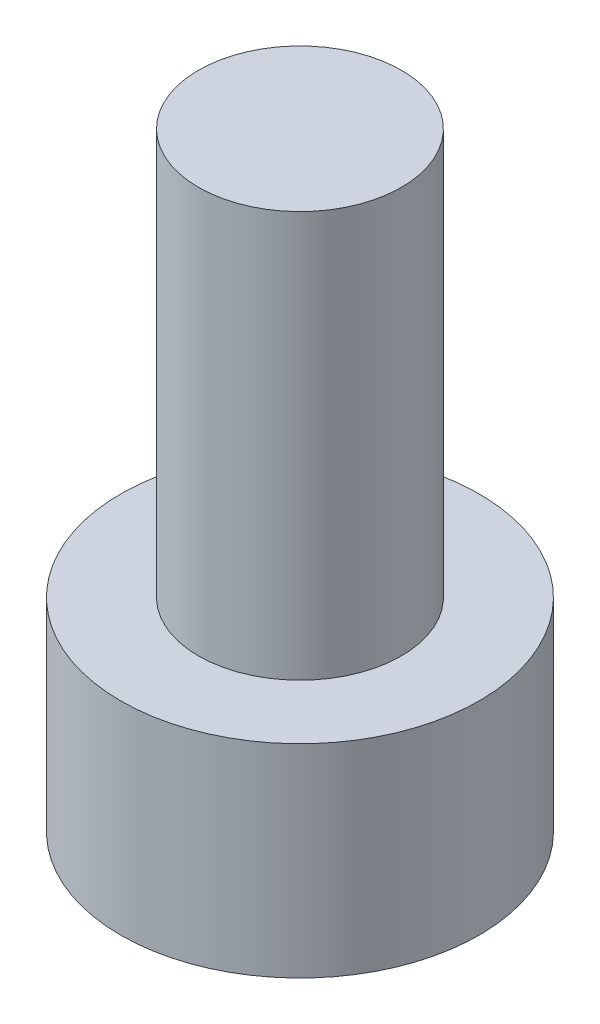
ISO-10303-21;
HEADER;
FILE_DESCRIPTION(('STEP AP214'),'2;1');
FILE_NAME('part.step','',(''),(''),'','','');
FILE_SCHEMA(('AUTOMOTIVE_DESIGN { 1 0 10303 214 1 1 1 1 }'));
ENDSEC;
DATA;
#1=APPLICATION_CONTEXT('core data for automotive mechanical design processes');
#2=APPLICATION_PROTOCOL_DEFINITION('international standard','automotive_design',2000,#1);
#3=PRODUCT_CONTEXT('',#1,'mechanical');
#4=PRODUCT('Part','Part','',(#3));
#5=PRODUCT_RELATED_PRODUCT_CATEGORY('part','',(#4));
#6=PRODUCT_DEFINITION_FORMATION('','',#4);
#7=PRODUCT_DEFINITION_CONTEXT('part definition',#1,'design');
#8=PRODUCT_DEFINITION('design','',#6,#7);
#9=PRODUCT_DEFINITION_SHAPE('','',#8);
#10=(LENGTH_UNIT() NAMED_UNIT(*) SI_UNIT(.MILLI.,.METRE.));
#11=(NAMED_UNIT(*) PLANE_ANGLE_UNIT() SI_UNIT($,.RADIAN.));
#12=(NAMED_UNIT(*) SI_UNIT($,.STERADIAN.) SOLID_ANGLE_UNIT());
#13=UNCERTAINTY_MEASURE_WITH_UNIT(LENGTH_MEASURE(1.E-05),#10,'distance_accuracy_value','');
#14=(GEOMETRIC_REPRESENTATION_CONTEXT(3) GLOBAL_UNCERTAINTY_ASSIGNED_CONTEXT((#13)) GLOBAL_UNIT_ASSIGNED_CONTEXT((#10,
#11,#12)) REPRESENTATION_CONTEXT('',''));
#15=CARTESIAN_POINT('',(0.,0.,0.));
#16=DIRECTION('',(0.,0.,1.));
#17=DIRECTION('',(1.,0.,0.));
#18=AXIS2_PLACEMENT_3D('',#15,#16,#17);
#19=CARTESIAN_POINT('',(0.,3.,0.));
#20=DIRECTION('',(0.,1.,0.));
#21=DIRECTION('',(0.,0.,1.));
#22=AXIS2_PLACEMENT_3D('',#19,#20,#21);
#23=PLANE('',#22);
#24=CARTESIAN_POINT('',(0.,3.,0.));
#25=DIRECTION('',(0.,1.,0.));
#26=DIRECTION('',(0.,0.,1.));
#27=AXIS2_PLACEMENT_3D('',#24,#25,#26);
#28=CIRCLE('',#27,1.5);
#29=CARTESIAN_POINT('',(0.,3.,1.5));
#30=VERTEX_POINT('',#29);
#31=EDGE_CURVE('E180',#30,#30,#28,.T.);
#32=ORIENTED_EDGE('',*,*,#31,.F.);
#33=EDGE_LOOP('',(#32));
#34=FACE_BOUND('',#33,.T.);
#35=CARTESIAN_POINT('',(0.,3.,0.));
#36=DIRECTION('',(0.,1.,0.));
#37=DIRECTION('',(0.,0.,1.));
#38=AXIS2_PLACEMENT_3D('',#35,#36,#37);
#39=CIRCLE('',#38,2.65);
#40=CARTESIAN_POINT('',(0.,3.,2.65));
#41=VERTEX_POINT('',#40);
#42=EDGE_CURVE('E11',#41,#41,#39,.T.);
#43=ORIENTED_EDGE('',*,*,#42,.T.);
#44=EDGE_LOOP('',(#43));
#45=FACE_BOUND('',#44,.T.);
#46=ADVANCED_FACE('F44',(#34,#45),#23,.T.);
#47=CARTESIAN_POINT('',(0.,0.,0.));
#48=DIRECTION('',(0.,1.,0.));
#49=DIRECTION('',(0.,0.,1.));
#50=AXIS2_PLACEMENT_3D('',#47,#48,#49);
#51=PLANE('',#50);
#52=CARTESIAN_POINT('',(0.,0.,0.));
#53=DIRECTION('',(0.,1.,0.));
#54=DIRECTION('',(0.,0.,1.));
#55=AXIS2_PLACEMENT_3D('',#52,#53,#54);
#56=CIRCLE('',#55,2.65);
#57=CARTESIAN_POINT('',(0.,0.,2.65));
#58=VERTEX_POINT('',#57);
#59=EDGE_CURVE('E48',#58,#58,#56,.T.);
#60=ORIENTED_EDGE('',*,*,#59,.F.);
#61=EDGE_LOOP('',(#60));
#62=FACE_BOUND('',#61,.T.);
#63=DIRECTION('',(-0.5,0.,-0.866025403784438));
#64=VECTOR('',#63,1.);
#65=CARTESIAN_POINT('',(1.44337567297406,0.,0.));
#66=LINE('',#65,#64);
#67=CARTESIAN_POINT('',(1.44337567297406,0.,0.));
#68=VERTEX_POINT('',#67);
#69=CARTESIAN_POINT('',(0.721687836487032,0.,-1.25));
#70=VERTEX_POINT('',#69);
#71=EDGE_CURVE('E59',#68,#70,#66,.T.);
#72=ORIENTED_EDGE('',*,*,#71,.T.);
#73=DIRECTION('',(-1.,0.,0.));
#74=VECTOR('',#73,1.);
#75=CARTESIAN_POINT('',(0.721687836487032,0.,-1.25));
#76=LINE('',#75,#74);
#77=CARTESIAN_POINT('',(-0.721687836487033,0.,-1.25));
#78=VERTEX_POINT('',#77);
#79=EDGE_CURVE('E119',#70,#78,#76,.T.);
#80=ORIENTED_EDGE('',*,*,#79,.T.);
#81=DIRECTION('',(-0.5,0.,0.866025403784439));
#82=VECTOR('',#81,1.);
#83=CARTESIAN_POINT('',(-0.721687836487033,0.,-1.25));
#84=LINE('',#83,#82);
#85=CARTESIAN_POINT('',(-1.44337567297406,0.,0.));
#86=VERTEX_POINT('',#85);
#87=EDGE_CURVE('E117',#78,#86,#84,.T.);
#88=ORIENTED_EDGE('',*,*,#87,.T.);
#89=DIRECTION('',(0.5,0.,0.866025403784438));
#90=VECTOR('',#89,1.);
#91=CARTESIAN_POINT('',(-1.44337567297406,0.,0.));
#92=LINE('',#91,#90);
#93=CARTESIAN_POINT('',(-0.721687836487031,0.,1.25));
#94=VERTEX_POINT('',#93);
#95=EDGE_CURVE('E95',#86,#94,#92,.T.);
#96=ORIENTED_EDGE('',*,*,#95,.T.);
#97=DIRECTION('',(1.,0.,0.));
#98=VECTOR('',#97,1.);
#99=CARTESIAN_POINT('',(-0.721687836487031,0.,1.25));
#100=LINE('',#99,#98);
#101=CARTESIAN_POINT('',(0.721687836487033,0.,1.25));
#102=VERTEX_POINT('',#101);
#103=EDGE_CURVE('E106',#94,#102,#100,.T.);
#104=ORIENTED_EDGE('',*,*,#103,.T.);
#105=DIRECTION('',(0.5,0.,-0.866025403784439));
#106=VECTOR('',#105,1.);
#107=CARTESIAN_POINT('',(0.721687836487033,0.,1.25));
#108=LINE('',#107,#106);
#109=EDGE_CURVE('E112',#102,#68,#108,.T.);
#110=ORIENTED_EDGE('',*,*,#109,.T.);
#111=EDGE_LOOP('',(#72,#80,#88,#96,#104,#110));
#112=FACE_BOUND('',#111,.T.);
#113=ADVANCED_FACE('F114',(#62,#112),#51,.F.);
#114=CARTESIAN_POINT('',(0.,3.,0.));
#115=DIRECTION('',(0.,-1.,0.));
#116=DIRECTION('',(0.,0.,-1.));
#117=AXIS2_PLACEMENT_3D('',#114,#115,#116);
#118=CYLINDRICAL_SURFACE('',#117,2.65);
#119=ORIENTED_EDGE('',*,*,#42,.F.);
#120=EDGE_LOOP('',(#119));
#121=FACE_BOUND('',#120,.T.);
#122=ORIENTED_EDGE('',*,*,#59,.T.);
#123=EDGE_LOOP('',(#122));
#124=FACE_BOUND('',#123,.T.);
#125=ADVANCED_FACE('F46',(#121,#124),#118,.T.);
#126=CARTESIAN_POINT('',(1.44337567297406,3.,0.));
#127=DIRECTION('',(-0.866025403784438,0.,0.5));
#128=DIRECTION('',(0.5,0.,0.866025403784438));
#129=AXIS2_PLACEMENT_3D('',#126,#127,#128);
#130=PLANE('',#129);
#131=ORIENTED_EDGE('',*,*,#71,.F.);
#132=DIRECTION('',(0.,-1.,0.));
#133=VECTOR('',#132,1.);
#134=CARTESIAN_POINT('',(1.44337567297406,3.,0.));
#135=LINE('',#134,#133);
#136=CARTESIAN_POINT('',(1.44337567297406,3.,0.));
#137=VERTEX_POINT('',#136);
#138=EDGE_CURVE('E124',#137,#68,#135,.T.);
#139=ORIENTED_EDGE('',*,*,#138,.F.);
#140=DIRECTION('',(-0.5,0.,-0.866025403784438));
#141=VECTOR('',#140,1.);
#142=CARTESIAN_POINT('',(1.44337567297406,3.,0.));
#143=LINE('',#142,#141);
#144=CARTESIAN_POINT('',(0.721687836487032,3.,-1.25));
#145=VERTEX_POINT('',#144);
#146=EDGE_CURVE('E68',#137,#145,#143,.T.);
#147=ORIENTED_EDGE('',*,*,#146,.T.);
#148=DIRECTION('',(0.,-1.,0.));
#149=VECTOR('',#148,1.);
#150=CARTESIAN_POINT('',(0.721687836487032,3.,-1.25));
#151=LINE('',#150,#149);
#152=EDGE_CURVE('E131',#145,#70,#151,.T.);
#153=ORIENTED_EDGE('',*,*,#152,.T.);
#154=EDGE_LOOP('',(#131,#139,#147,#153));
#155=FACE_BOUND('',#154,.T.);
#156=ADVANCED_FACE('F142',(#155),#130,.T.);
#157=CARTESIAN_POINT('',(0.721687836487032,3.,-1.25));
#158=DIRECTION('',(0.,0.,1.));
#159=DIRECTION('',(1.,0.,0.));
#160=AXIS2_PLACEMENT_3D('',#157,#158,#159);
#161=PLANE('',#160);
#162=ORIENTED_EDGE('',*,*,#79,.F.);
#163=ORIENTED_EDGE('',*,*,#152,.F.);
#164=DIRECTION('',(-1.,0.,0.));
#165=VECTOR('',#164,1.);
#166=CARTESIAN_POINT('',(0.721687836487032,3.,-1.25));
#167=LINE('',#166,#165);
#168=CARTESIAN_POINT('',(-0.721687836487033,3.,-1.25));
#169=VERTEX_POINT('',#168);
#170=EDGE_CURVE('E187',#145,#169,#167,.T.);
#171=ORIENTED_EDGE('',*,*,#170,.T.);
#172=DIRECTION('',(0.,-1.,0.));
#173=VECTOR('',#172,1.);
#174=CARTESIAN_POINT('',(-0.721687836487033,3.,-1.25));
#175=LINE('',#174,#173);
#176=EDGE_CURVE('E129',#169,#78,#175,.T.);
#177=ORIENTED_EDGE('',*,*,#176,.T.);
#178=EDGE_LOOP('',(#162,#163,#171,#177));
#179=FACE_BOUND('',#178,.T.);
#180=ADVANCED_FACE('F149',(#179),#161,.T.);
#181=CARTESIAN_POINT('',(-0.721687836487033,3.,-1.25));
#182=DIRECTION('',(0.866025403784439,0.,0.5));
#183=DIRECTION('',(0.5,0.,-0.866025403784439));
#184=AXIS2_PLACEMENT_3D('',#181,#182,#183);
#185=PLANE('',#184);
#186=ORIENTED_EDGE('',*,*,#87,.F.);
#187=ORIENTED_EDGE('',*,*,#176,.F.);
#188=DIRECTION('',(-0.5,0.,0.866025403784439));
#189=VECTOR('',#188,1.);
#190=CARTESIAN_POINT('',(-0.721687836487033,3.,-1.25));
#191=LINE('',#190,#189);
#192=CARTESIAN_POINT('',(-1.44337567297406,3.,0.));
#193=VERTEX_POINT('',#192);
#194=EDGE_CURVE('E190',#169,#193,#191,.T.);
#195=ORIENTED_EDGE('',*,*,#194,.T.);
#196=DIRECTION('',(0.,-1.,0.));
#197=VECTOR('',#196,1.);
#198=CARTESIAN_POINT('',(-1.44337567297406,3.,0.));
#199=LINE('',#198,#197);
#200=EDGE_CURVE('E102',#193,#86,#199,.T.);
#201=ORIENTED_EDGE('',*,*,#200,.T.);
#202=EDGE_LOOP('',(#186,#187,#195,#201));
#203=FACE_BOUND('',#202,.T.);
#204=ADVANCED_FACE('F152',(#203),#185,.T.);
#205=CARTESIAN_POINT('',(-1.44337567297406,3.,0.));
#206=DIRECTION('',(0.866025403784438,0.,-0.500000000000001));
#207=DIRECTION('',(-0.500000000000001,0.,-0.866025403784438));
#208=AXIS2_PLACEMENT_3D('',#205,#206,#207);
#209=PLANE('',#208);
#210=ORIENTED_EDGE('',*,*,#95,.F.);
#211=ORIENTED_EDGE('',*,*,#200,.F.);
#212=DIRECTION('',(0.5,0.,0.866025403784438));
#213=VECTOR('',#212,1.);
#214=CARTESIAN_POINT('',(-1.44337567297406,3.,0.));
#215=LINE('',#214,#213);
#216=CARTESIAN_POINT('',(-0.721687836487031,3.,1.25));
#217=VERTEX_POINT('',#216);
#218=EDGE_CURVE('E99',#193,#217,#215,.T.);
#219=ORIENTED_EDGE('',*,*,#218,.T.);
#220=DIRECTION('',(0.,-1.,0.));
#221=VECTOR('',#220,1.);
#222=CARTESIAN_POINT('',(-0.721687836487031,3.,1.25));
#223=LINE('',#222,#221);
#224=EDGE_CURVE('E90',#217,#94,#223,.T.);
#225=ORIENTED_EDGE('',*,*,#224,.T.);
#226=EDGE_LOOP('',(#210,#211,#219,#225));
#227=FACE_BOUND('',#226,.T.);
#228=ADVANCED_FACE('F92',(#227),#209,.T.);
#229=CARTESIAN_POINT('',(-0.721687836487031,3.,1.25));
#230=DIRECTION('',(0.,0.,-1.));
#231=DIRECTION('',(-1.,0.,0.));
#232=AXIS2_PLACEMENT_3D('',#229,#230,#231);
#233=PLANE('',#232);
#234=ORIENTED_EDGE('',*,*,#103,.F.);
#235=ORIENTED_EDGE('',*,*,#224,.F.);
#236=DIRECTION('',(1.,0.,0.));
#237=VECTOR('',#236,1.);
#238=CARTESIAN_POINT('',(-0.721687836487031,3.,1.25));
#239=LINE('',#238,#237);
#240=CARTESIAN_POINT('',(0.721687836487033,3.,1.25));
#241=VERTEX_POINT('',#240);
#242=EDGE_CURVE('E194',#217,#241,#239,.T.);
#243=ORIENTED_EDGE('',*,*,#242,.T.);
#244=DIRECTION('',(0.,-1.,0.));
#245=VECTOR('',#244,1.);
#246=CARTESIAN_POINT('',(0.721687836487033,3.,1.25));
#247=LINE('',#246,#245);
#248=EDGE_CURVE('E103',#241,#102,#247,.T.);
#249=ORIENTED_EDGE('',*,*,#248,.T.);
#250=EDGE_LOOP('',(#234,#235,#243,#249));
#251=FACE_BOUND('',#250,.T.);
#252=ADVANCED_FACE('F107',(#251),#233,.T.);
#253=CARTESIAN_POINT('',(0.721687836487033,3.,1.25));
#254=DIRECTION('',(-0.866025403784439,0.,-0.5));
#255=DIRECTION('',(-0.5,0.,0.866025403784439));
#256=AXIS2_PLACEMENT_3D('',#253,#254,#255);
#257=PLANE('',#256);
#258=ORIENTED_EDGE('',*,*,#109,.F.);
#259=ORIENTED_EDGE('',*,*,#248,.F.);
#260=DIRECTION('',(0.5,0.,-0.866025403784439));
#261=VECTOR('',#260,1.);
#262=CARTESIAN_POINT('',(0.721687836487033,3.,1.25));
#263=LINE('',#262,#261);
#264=EDGE_CURVE('E126',#241,#137,#263,.T.);
#265=ORIENTED_EDGE('',*,*,#264,.T.);
#266=ORIENTED_EDGE('',*,*,#138,.T.);
#267=EDGE_LOOP('',(#258,#259,#265,#266));
#268=FACE_BOUND('',#267,.T.);
#269=ADVANCED_FACE('F161',(#268),#257,.T.);
#270=CARTESIAN_POINT('',(0.,3.,0.));
#271=DIRECTION('',(0.,1.,0.));
#272=DIRECTION('',(0.,0.,1.));
#273=AXIS2_PLACEMENT_3D('',#270,#271,#272);
#274=PLANE('',#273);
#275=ORIENTED_EDGE('',*,*,#146,.F.);
#276=ORIENTED_EDGE('',*,*,#264,.F.);
#277=ORIENTED_EDGE('',*,*,#242,.F.);
#278=ORIENTED_EDGE('',*,*,#218,.F.);
#279=ORIENTED_EDGE('',*,*,#194,.F.);
#280=ORIENTED_EDGE('',*,*,#170,.F.);
#281=EDGE_LOOP('',(#275,#276,#277,#278,#279,#280));
#282=FACE_BOUND('',#281,.T.);
#283=ADVANCED_FACE('F164',(#282),#274,.F.);
#284=CARTESIAN_POINT('',(0.,9.,0.));
#285=DIRECTION('',(0.,-1.,0.));
#286=DIRECTION('',(0.,0.,-1.));
#287=AXIS2_PLACEMENT_3D('',#284,#285,#286);
#288=CYLINDRICAL_SURFACE('',#287,1.5);
#289=CARTESIAN_POINT('',(0.,9.,0.));
#290=DIRECTION('',(0.,1.,0.));
#291=DIRECTION('',(0.,0.,1.));
#292=AXIS2_PLACEMENT_3D('',#289,#290,#291);
#293=CIRCLE('',#292,1.5);
#294=CARTESIAN_POINT('',(0.,9.,1.5));
#295=VERTEX_POINT('',#294);
#296=EDGE_CURVE('E179',#295,#295,#293,.T.);
#297=ORIENTED_EDGE('',*,*,#296,.F.);
#298=EDGE_LOOP('',(#297));
#299=FACE_BOUND('',#298,.T.);
#300=ORIENTED_EDGE('',*,*,#31,.T.);
#301=EDGE_LOOP('',(#300));
#302=FACE_BOUND('',#301,.T.);
#303=ADVANCED_FACE('F166',(#299,#302),#288,.T.);
#304=CARTESIAN_POINT('',(0.,9.,0.));
#305=DIRECTION('',(0.,1.,0.));
#306=DIRECTION('',(0.,0.,1.));
#307=AXIS2_PLACEMENT_3D('',#304,#305,#306);
#308=PLANE('',#307);
#309=ORIENTED_EDGE('',*,*,#296,.T.);
#310=EDGE_LOOP('',(#309));
#311=FACE_BOUND('',#310,.T.);
#312=ADVANCED_FACE('F169',(#311),#308,.T.);
#313=CLOSED_SHELL('',(#46,#113,#125,#156,#180,#204,#228,#252,#269,#283,#303,#312));
#314=MANIFOLD_SOLID_BREP('B2',#313);
#315=ADVANCED_BREP_SHAPE_REPRESENTATION('',(#18,#314),#14);
#316=SHAPE_DEFINITION_REPRESENTATION(#9,#315);
ENDSEC;
END-ISO-10303-21;
